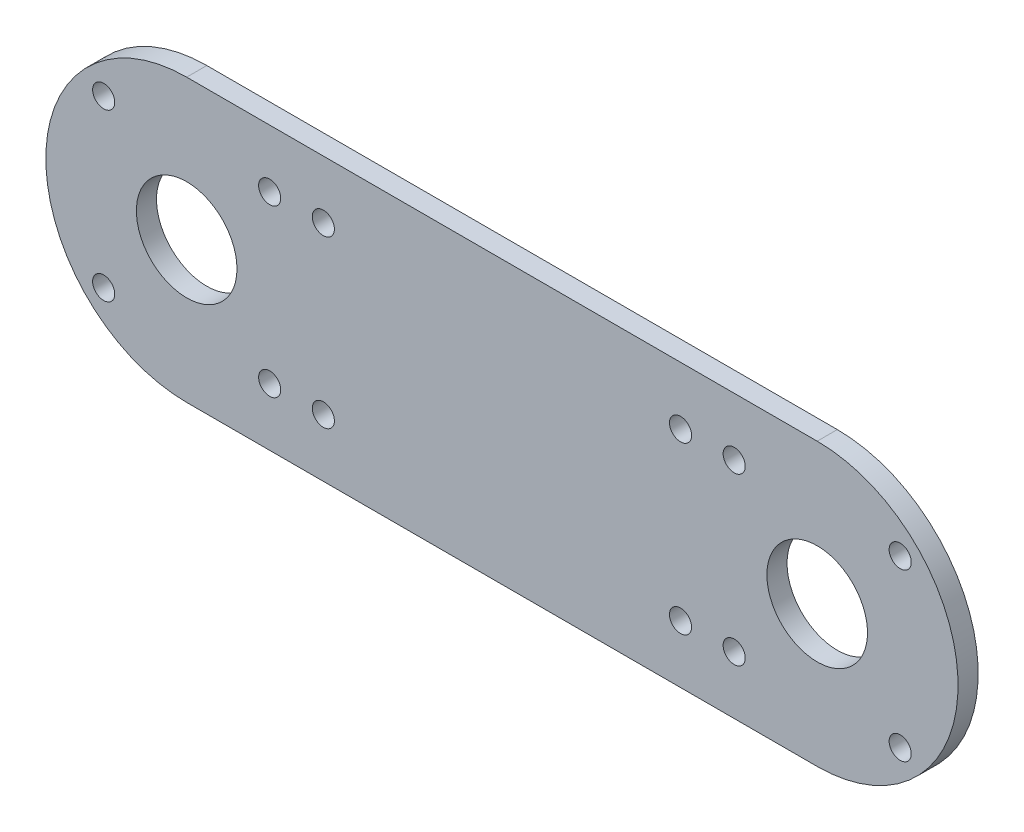
ISO-10303-21;
HEADER;
FILE_DESCRIPTION(('STEP AP214'),'2;1');
FILE_NAME('part.step','',(''),(''),'','','');
FILE_SCHEMA(('AUTOMOTIVE_DESIGN { 1 0 10303 214 1 1 1 1 }'));
ENDSEC;
DATA;
#1=APPLICATION_CONTEXT('core data for automotive mechanical design processes');
#2=APPLICATION_PROTOCOL_DEFINITION('international standard','automotive_design',2000,#1);
#3=PRODUCT_CONTEXT('',#1,'mechanical');
#4=PRODUCT('Part','Part','',(#3));
#5=PRODUCT_RELATED_PRODUCT_CATEGORY('part','',(#4));
#6=PRODUCT_DEFINITION_FORMATION('','',#4);
#7=PRODUCT_DEFINITION_CONTEXT('part definition',#1,'design');
#8=PRODUCT_DEFINITION('design','',#6,#7);
#9=PRODUCT_DEFINITION_SHAPE('','',#8);
#10=(LENGTH_UNIT() NAMED_UNIT(*) SI_UNIT(.MILLI.,.METRE.));
#11=(NAMED_UNIT(*) PLANE_ANGLE_UNIT() SI_UNIT($,.RADIAN.));
#12=(NAMED_UNIT(*) SI_UNIT($,.STERADIAN.) SOLID_ANGLE_UNIT());
#13=UNCERTAINTY_MEASURE_WITH_UNIT(LENGTH_MEASURE(1.E-05),#10,'distance_accuracy_value','');
#14=(GEOMETRIC_REPRESENTATION_CONTEXT(3) GLOBAL_UNCERTAINTY_ASSIGNED_CONTEXT((#13)) GLOBAL_UNIT_ASSIGNED_CONTEXT((#10,
#11,#12)) REPRESENTATION_CONTEXT('',''));
#15=CARTESIAN_POINT('',(0.,0.,0.));
#16=DIRECTION('',(0.,0.,1.));
#17=DIRECTION('',(1.,0.,0.));
#18=AXIS2_PLACEMENT_3D('',#15,#16,#17);
#19=CARTESIAN_POINT('',(82.5,-21.,3.));
#20=DIRECTION('',(0.,1.,0.));
#21=DIRECTION('',(0.,0.,1.));
#22=AXIS2_PLACEMENT_3D('',#19,#20,#21);
#23=PLANE('',#22);
#24=DIRECTION('',(1.,0.,0.));
#25=VECTOR('',#24,1.);
#26=CARTESIAN_POINT('',(82.5,-21.,3.));
#27=LINE('',#26,#25);
#28=CARTESIAN_POINT('',(-47.,-21.,3.));
#29=VERTEX_POINT('',#28);
#30=CARTESIAN_POINT('',(47.,-21.,3.));
#31=VERTEX_POINT('',#30);
#32=EDGE_CURVE('E43',#29,#31,#27,.T.);
#33=ORIENTED_EDGE('',*,*,#32,.F.);
#34=DIRECTION('',(0.,0.,1.));
#35=VECTOR('',#34,1.);
#36=CARTESIAN_POINT('',(-47.,-21.,0.));
#37=LINE('',#36,#35);
#38=CARTESIAN_POINT('',(-47.,-21.,0.));
#39=VERTEX_POINT('',#38);
#40=EDGE_CURVE('E82',#39,#29,#37,.T.);
#41=ORIENTED_EDGE('',*,*,#40,.F.);
#42=DIRECTION('',(1.,0.,0.));
#43=VECTOR('',#42,1.);
#44=CARTESIAN_POINT('',(82.5,-21.,0.));
#45=LINE('',#44,#43);
#46=CARTESIAN_POINT('',(47.,-21.,0.));
#47=VERTEX_POINT('',#46);
#48=EDGE_CURVE('E90',#39,#47,#45,.T.);
#49=ORIENTED_EDGE('',*,*,#48,.T.);
#50=DIRECTION('',(0.,0.,1.));
#51=VECTOR('',#50,1.);
#52=CARTESIAN_POINT('',(47.,-21.,0.));
#53=LINE('',#52,#51);
#54=EDGE_CURVE('E159',#47,#31,#53,.T.);
#55=ORIENTED_EDGE('',*,*,#54,.T.);
#56=EDGE_LOOP('',(#33,#41,#49,#55));
#57=FACE_BOUND('',#56,.T.);
#58=ADVANCED_FACE('F35',(#57),#23,.F.);
#59=CARTESIAN_POINT('',(82.5,21.,3.));
#60=DIRECTION('',(0.,-1.,0.));
#61=DIRECTION('',(0.,0.,-1.));
#62=AXIS2_PLACEMENT_3D('',#59,#60,#61);
#63=PLANE('',#62);
#64=DIRECTION('',(0.,0.,1.));
#65=VECTOR('',#64,1.);
#66=CARTESIAN_POINT('',(-47.,21.,0.));
#67=LINE('',#66,#65);
#68=CARTESIAN_POINT('',(-47.,21.,0.));
#69=VERTEX_POINT('',#68);
#70=CARTESIAN_POINT('',(-47.,21.,3.));
#71=VERTEX_POINT('',#70);
#72=EDGE_CURVE('E74',#69,#71,#67,.T.);
#73=ORIENTED_EDGE('',*,*,#72,.T.);
#74=DIRECTION('',(-1.,0.,0.));
#75=VECTOR('',#74,1.);
#76=CARTESIAN_POINT('',(82.5,21.,3.));
#77=LINE('',#76,#75);
#78=CARTESIAN_POINT('',(47.,21.,3.));
#79=VERTEX_POINT('',#78);
#80=EDGE_CURVE('E11',#79,#71,#77,.T.);
#81=ORIENTED_EDGE('',*,*,#80,.F.);
#82=DIRECTION('',(0.,0.,1.));
#83=VECTOR('',#82,1.);
#84=CARTESIAN_POINT('',(47.,21.,0.));
#85=LINE('',#84,#83);
#86=CARTESIAN_POINT('',(47.,21.,0.));
#87=VERTEX_POINT('',#86);
#88=EDGE_CURVE('E93',#87,#79,#85,.T.);
#89=ORIENTED_EDGE('',*,*,#88,.F.);
#90=DIRECTION('',(-1.,0.,0.));
#91=VECTOR('',#90,1.);
#92=CARTESIAN_POINT('',(82.5,21.,0.));
#93=LINE('',#92,#91);
#94=EDGE_CURVE('E38',#87,#69,#93,.T.);
#95=ORIENTED_EDGE('',*,*,#94,.T.);
#96=EDGE_LOOP('',(#73,#81,#89,#95));
#97=FACE_BOUND('',#96,.T.);
#98=ADVANCED_FACE('F92',(#97),#63,.F.);
#99=CARTESIAN_POINT('',(0.,0.,3.));
#100=DIRECTION('',(0.,0.,1.));
#101=DIRECTION('',(1.,0.,0.));
#102=AXIS2_PLACEMENT_3D('',#99,#100,#101);
#103=PLANE('',#102);
#104=CARTESIAN_POINT('',(-26.6256313292354,-12.3743686707646,3.));
#105=DIRECTION('',(0.,0.,1.));
#106=DIRECTION('',(1.,0.,0.));
#107=AXIS2_PLACEMENT_3D('',#104,#105,#106);
#108=CIRCLE('',#107,1.65);
#109=CARTESIAN_POINT('',(-24.9756313292354,-12.3743686707646,3.));
#110=VERTEX_POINT('',#109);
#111=EDGE_CURVE('E181',#110,#110,#108,.T.);
#112=ORIENTED_EDGE('',*,*,#111,.F.);
#113=EDGE_LOOP('',(#112));
#114=FACE_BOUND('',#113,.T.);
#115=CARTESIAN_POINT('',(26.6256313292354,12.3743686707646,3.));
#116=DIRECTION('',(0.,0.,1.));
#117=DIRECTION('',(1.,0.,0.));
#118=AXIS2_PLACEMENT_3D('',#115,#116,#117);
#119=CIRCLE('',#118,1.65);
#120=CARTESIAN_POINT('',(28.2756313292354,12.3743686707646,3.));
#121=VERTEX_POINT('',#120);
#122=EDGE_CURVE('E174',#121,#121,#119,.T.);
#123=ORIENTED_EDGE('',*,*,#122,.F.);
#124=EDGE_LOOP('',(#123));
#125=FACE_BOUND('',#124,.T.);
#126=CARTESIAN_POINT('',(26.6256313292354,-12.3743686707646,3.));
#127=DIRECTION('',(0.,0.,1.));
#128=DIRECTION('',(1.,0.,0.));
#129=AXIS2_PLACEMENT_3D('',#126,#127,#128);
#130=CIRCLE('',#129,1.65);
#131=CARTESIAN_POINT('',(28.2756313292354,-12.3743686707646,3.));
#132=VERTEX_POINT('',#131);
#133=EDGE_CURVE('E186',#132,#132,#130,.T.);
#134=ORIENTED_EDGE('',*,*,#133,.F.);
#135=EDGE_LOOP('',(#134));
#136=FACE_BOUND('',#135,.T.);
#137=CARTESIAN_POINT('',(-26.6256313292354,12.3743686707646,3.));
#138=DIRECTION('',(0.,0.,1.));
#139=DIRECTION('',(1.,0.,0.));
#140=AXIS2_PLACEMENT_3D('',#137,#138,#139);
#141=CIRCLE('',#140,1.65);
#142=CARTESIAN_POINT('',(-24.9756313292354,12.3743686707646,3.));
#143=VERTEX_POINT('',#142);
#144=EDGE_CURVE('E168',#143,#143,#141,.T.);
#145=ORIENTED_EDGE('',*,*,#144,.F.);
#146=EDGE_LOOP('',(#145));
#147=FACE_BOUND('',#146,.T.);
#148=CARTESIAN_POINT('',(-47.,0.,3.));
#149=DIRECTION('',(0.,0.,-1.));
#150=DIRECTION('',(1.,0.,0.));
#151=AXIS2_PLACEMENT_3D('',#148,#149,#150);
#152=CIRCLE('',#151,21.);
#153=EDGE_CURVE('E51',#29,#71,#152,.T.);
#154=ORIENTED_EDGE('',*,*,#153,.F.);
#155=ORIENTED_EDGE('',*,*,#32,.T.);
#156=CARTESIAN_POINT('',(47.,0.,3.));
#157=DIRECTION('',(0.,0.,-1.));
#158=DIRECTION('',(1.,0.,0.));
#159=AXIS2_PLACEMENT_3D('',#156,#157,#158);
#160=CIRCLE('',#159,21.);
#161=EDGE_CURVE('E162',#79,#31,#160,.T.);
#162=ORIENTED_EDGE('',*,*,#161,.F.);
#163=ORIENTED_EDGE('',*,*,#80,.T.);
#164=EDGE_LOOP('',(#154,#155,#162,#163));
#165=FACE_BOUND('',#164,.T.);
#166=CARTESIAN_POINT('',(59.3743686707646,12.3743686707646,3.));
#167=DIRECTION('',(0.,0.,1.));
#168=DIRECTION('',(-1.,0.,0.));
#169=AXIS2_PLACEMENT_3D('',#166,#167,#168);
#170=CIRCLE('',#169,1.65);
#171=CARTESIAN_POINT('',(57.7243686707646,12.3743686707646,3.));
#172=VERTEX_POINT('',#171);
#173=EDGE_CURVE('E145',#172,#172,#170,.T.);
#174=ORIENTED_EDGE('',*,*,#173,.F.);
#175=EDGE_LOOP('',(#174));
#176=FACE_BOUND('',#175,.T.);
#177=CARTESIAN_POINT('',(34.6256313292354,-12.3743686707646,3.));
#178=DIRECTION('',(0.,0.,1.));
#179=DIRECTION('',(-1.,0.,0.));
#180=AXIS2_PLACEMENT_3D('',#177,#178,#179);
#181=CIRCLE('',#180,1.65);
#182=CARTESIAN_POINT('',(32.9756313292354,-12.3743686707646,3.));
#183=VERTEX_POINT('',#182);
#184=EDGE_CURVE('E133',#183,#183,#181,.T.);
#185=ORIENTED_EDGE('',*,*,#184,.F.);
#186=EDGE_LOOP('',(#185));
#187=FACE_BOUND('',#186,.T.);
#188=CARTESIAN_POINT('',(-59.3743686707646,-12.3743686707646,3.));
#189=DIRECTION('',(0.,0.,1.));
#190=DIRECTION('',(1.,0.,0.));
#191=AXIS2_PLACEMENT_3D('',#188,#189,#190);
#192=CIRCLE('',#191,1.65);
#193=CARTESIAN_POINT('',(-57.7243686707646,-12.3743686707646,3.));
#194=VERTEX_POINT('',#193);
#195=EDGE_CURVE('E121',#194,#194,#192,.T.);
#196=ORIENTED_EDGE('',*,*,#195,.F.);
#197=EDGE_LOOP('',(#196));
#198=FACE_BOUND('',#197,.T.);
#199=CARTESIAN_POINT('',(-34.6256313292354,12.3743686707646,3.));
#200=DIRECTION('',(0.,0.,1.));
#201=DIRECTION('',(1.,0.,0.));
#202=AXIS2_PLACEMENT_3D('',#199,#200,#201);
#203=CIRCLE('',#202,1.65);
#204=CARTESIAN_POINT('',(-32.9756313292354,12.3743686707646,3.));
#205=VERTEX_POINT('',#204);
#206=EDGE_CURVE('E109',#205,#205,#203,.T.);
#207=ORIENTED_EDGE('',*,*,#206,.F.);
#208=EDGE_LOOP('',(#207));
#209=FACE_BOUND('',#208,.T.);
#210=CARTESIAN_POINT('',(-47.,0.,3.));
#211=DIRECTION('',(0.,0.,1.));
#212=DIRECTION('',(1.,0.,0.));
#213=AXIS2_PLACEMENT_3D('',#210,#211,#212);
#214=CIRCLE('',#213,7.5);
#215=CARTESIAN_POINT('',(-39.5,0.,3.));
#216=VERTEX_POINT('',#215);
#217=EDGE_CURVE('E96',#216,#216,#214,.T.);
#218=ORIENTED_EDGE('',*,*,#217,.F.);
#219=EDGE_LOOP('',(#218));
#220=FACE_BOUND('',#219,.T.);
#221=CARTESIAN_POINT('',(-59.3743686707646,12.3743686707646,3.));
#222=DIRECTION('',(0.,0.,1.));
#223=DIRECTION('',(1.,0.,0.));
#224=AXIS2_PLACEMENT_3D('',#221,#222,#223);
#225=CIRCLE('',#224,1.65);
#226=CARTESIAN_POINT('',(-57.7243686707646,12.3743686707646,3.));
#227=VERTEX_POINT('',#226);
#228=EDGE_CURVE('E104',#227,#227,#225,.T.);
#229=ORIENTED_EDGE('',*,*,#228,.F.);
#230=EDGE_LOOP('',(#229));
#231=FACE_BOUND('',#230,.T.);
#232=CARTESIAN_POINT('',(-34.6256313292354,-12.3743686707646,3.));
#233=DIRECTION('',(0.,0.,1.));
#234=DIRECTION('',(1.,0.,0.));
#235=AXIS2_PLACEMENT_3D('',#232,#233,#234);
#236=CIRCLE('',#235,1.65);
#237=CARTESIAN_POINT('',(-32.9756313292354,-12.3743686707646,3.));
#238=VERTEX_POINT('',#237);
#239=EDGE_CURVE('E115',#238,#238,#236,.T.);
#240=ORIENTED_EDGE('',*,*,#239,.F.);
#241=EDGE_LOOP('',(#240));
#242=FACE_BOUND('',#241,.T.);
#243=CARTESIAN_POINT('',(59.3743686707646,-12.3743686707646,3.));
#244=DIRECTION('',(0.,0.,1.));
#245=DIRECTION('',(-1.,0.,0.));
#246=AXIS2_PLACEMENT_3D('',#243,#244,#245);
#247=CIRCLE('',#246,1.65);
#248=CARTESIAN_POINT('',(57.7243686707646,-12.3743686707646,3.));
#249=VERTEX_POINT('',#248);
#250=EDGE_CURVE('E127',#249,#249,#247,.T.);
#251=ORIENTED_EDGE('',*,*,#250,.F.);
#252=EDGE_LOOP('',(#251));
#253=FACE_BOUND('',#252,.T.);
#254=CARTESIAN_POINT('',(34.6256313292354,12.3743686707646,3.));
#255=DIRECTION('',(0.,0.,1.));
#256=DIRECTION('',(-1.,0.,0.));
#257=AXIS2_PLACEMENT_3D('',#254,#255,#256);
#258=CIRCLE('',#257,1.65);
#259=CARTESIAN_POINT('',(32.9756313292354,12.3743686707646,3.));
#260=VERTEX_POINT('',#259);
#261=EDGE_CURVE('E139',#260,#260,#258,.T.);
#262=ORIENTED_EDGE('',*,*,#261,.F.);
#263=EDGE_LOOP('',(#262));
#264=FACE_BOUND('',#263,.T.);
#265=CARTESIAN_POINT('',(47.,0.,3.));
#266=DIRECTION('',(0.,0.,1.));
#267=DIRECTION('',(-1.,0.,0.));
#268=AXIS2_PLACEMENT_3D('',#265,#266,#267);
#269=CIRCLE('',#268,7.5);
#270=CARTESIAN_POINT('',(39.5,0.,3.));
#271=VERTEX_POINT('',#270);
#272=EDGE_CURVE('E151',#271,#271,#269,.T.);
#273=ORIENTED_EDGE('',*,*,#272,.F.);
#274=EDGE_LOOP('',(#273));
#275=FACE_BOUND('',#274,.T.);
#276=ADVANCED_FACE('F202',(#114,#125,#136,#147,#165,#176,#187,#198,#209,#220,#231,#242,#253,
#264,#275),#103,.T.);
#277=CARTESIAN_POINT('',(0.,0.,0.));
#278=DIRECTION('',(0.,0.,1.));
#279=DIRECTION('',(1.,0.,0.));
#280=AXIS2_PLACEMENT_3D('',#277,#278,#279);
#281=PLANE('',#280);
#282=CARTESIAN_POINT('',(-26.6256313292354,-12.3743686707646,0.));
#283=DIRECTION('',(0.,0.,1.));
#284=DIRECTION('',(1.,0.,0.));
#285=AXIS2_PLACEMENT_3D('',#282,#283,#284);
#286=CIRCLE('',#285,1.65);
#287=CARTESIAN_POINT('',(-24.9756313292354,-12.3743686707646,0.));
#288=VERTEX_POINT('',#287);
#289=EDGE_CURVE('E171',#288,#288,#286,.T.);
#290=ORIENTED_EDGE('',*,*,#289,.T.);
#291=EDGE_LOOP('',(#290));
#292=FACE_BOUND('',#291,.T.);
#293=CARTESIAN_POINT('',(26.6256313292354,12.3743686707646,0.));
#294=DIRECTION('',(0.,0.,1.));
#295=DIRECTION('',(1.,0.,0.));
#296=AXIS2_PLACEMENT_3D('',#293,#294,#295);
#297=CIRCLE('',#296,1.65);
#298=CARTESIAN_POINT('',(28.2756313292354,12.3743686707646,0.));
#299=VERTEX_POINT('',#298);
#300=EDGE_CURVE('E177',#299,#299,#297,.T.);
#301=ORIENTED_EDGE('',*,*,#300,.T.);
#302=EDGE_LOOP('',(#301));
#303=FACE_BOUND('',#302,.T.);
#304=CARTESIAN_POINT('',(26.6256313292354,-12.3743686707646,0.));
#305=DIRECTION('',(0.,0.,1.));
#306=DIRECTION('',(1.,0.,0.));
#307=AXIS2_PLACEMENT_3D('',#304,#305,#306);
#308=CIRCLE('',#307,1.65);
#309=CARTESIAN_POINT('',(28.2756313292354,-12.3743686707646,0.));
#310=VERTEX_POINT('',#309);
#311=EDGE_CURVE('E178',#310,#310,#308,.T.);
#312=ORIENTED_EDGE('',*,*,#311,.T.);
#313=EDGE_LOOP('',(#312));
#314=FACE_BOUND('',#313,.T.);
#315=CARTESIAN_POINT('',(-26.6256313292354,12.3743686707646,0.));
#316=DIRECTION('',(0.,0.,1.));
#317=DIRECTION('',(1.,0.,0.));
#318=AXIS2_PLACEMENT_3D('',#315,#316,#317);
#319=CIRCLE('',#318,1.65);
#320=CARTESIAN_POINT('',(-24.9756313292354,12.3743686707646,0.));
#321=VERTEX_POINT('',#320);
#322=EDGE_CURVE('E164',#321,#321,#319,.T.);
#323=ORIENTED_EDGE('',*,*,#322,.T.);
#324=EDGE_LOOP('',(#323));
#325=FACE_BOUND('',#324,.T.);
#326=ORIENTED_EDGE('',*,*,#48,.F.);
#327=CARTESIAN_POINT('',(-47.,0.,0.));
#328=DIRECTION('',(0.,0.,-1.));
#329=DIRECTION('',(1.,0.,0.));
#330=AXIS2_PLACEMENT_3D('',#327,#328,#329);
#331=CIRCLE('',#330,21.);
#332=EDGE_CURVE('E77',#39,#69,#331,.T.);
#333=ORIENTED_EDGE('',*,*,#332,.T.);
#334=ORIENTED_EDGE('',*,*,#94,.F.);
#335=CARTESIAN_POINT('',(47.,0.,0.));
#336=DIRECTION('',(0.,0.,-1.));
#337=DIRECTION('',(1.,0.,0.));
#338=AXIS2_PLACEMENT_3D('',#335,#336,#337);
#339=CIRCLE('',#338,21.);
#340=EDGE_CURVE('E59',#87,#47,#339,.T.);
#341=ORIENTED_EDGE('',*,*,#340,.T.);
#342=EDGE_LOOP('',(#326,#333,#334,#341));
#343=FACE_BOUND('',#342,.T.);
#344=CARTESIAN_POINT('',(-47.,0.,0.));
#345=DIRECTION('',(0.,0.,1.));
#346=DIRECTION('',(1.,0.,0.));
#347=AXIS2_PLACEMENT_3D('',#344,#345,#346);
#348=CIRCLE('',#347,7.5);
#349=CARTESIAN_POINT('',(-39.5,0.,0.));
#350=VERTEX_POINT('',#349);
#351=EDGE_CURVE('E100',#350,#350,#348,.T.);
#352=ORIENTED_EDGE('',*,*,#351,.T.);
#353=EDGE_LOOP('',(#352));
#354=FACE_BOUND('',#353,.T.);
#355=CARTESIAN_POINT('',(-59.3743686707646,12.3743686707646,0.));
#356=DIRECTION('',(0.,0.,1.));
#357=DIRECTION('',(1.,0.,0.));
#358=AXIS2_PLACEMENT_3D('',#355,#356,#357);
#359=CIRCLE('',#358,1.65);
#360=CARTESIAN_POINT('',(-57.7243686707646,12.3743686707646,0.));
#361=VERTEX_POINT('',#360);
#362=EDGE_CURVE('E106',#361,#361,#359,.T.);
#363=ORIENTED_EDGE('',*,*,#362,.T.);
#364=EDGE_LOOP('',(#363));
#365=FACE_BOUND('',#364,.T.);
#366=CARTESIAN_POINT('',(-34.6256313292354,12.3743686707646,0.));
#367=DIRECTION('',(0.,0.,1.));
#368=DIRECTION('',(1.,0.,0.));
#369=AXIS2_PLACEMENT_3D('',#366,#367,#368);
#370=CIRCLE('',#369,1.65);
#371=CARTESIAN_POINT('',(-32.9756313292354,12.3743686707646,0.));
#372=VERTEX_POINT('',#371);
#373=EDGE_CURVE('E112',#372,#372,#370,.T.);
#374=ORIENTED_EDGE('',*,*,#373,.T.);
#375=EDGE_LOOP('',(#374));
#376=FACE_BOUND('',#375,.T.);
#377=CARTESIAN_POINT('',(-34.6256313292354,-12.3743686707646,0.));
#378=DIRECTION('',(0.,0.,1.));
#379=DIRECTION('',(1.,0.,0.));
#380=AXIS2_PLACEMENT_3D('',#377,#378,#379);
#381=CIRCLE('',#380,1.65);
#382=CARTESIAN_POINT('',(-32.9756313292354,-12.3743686707646,0.));
#383=VERTEX_POINT('',#382);
#384=EDGE_CURVE('E118',#383,#383,#381,.T.);
#385=ORIENTED_EDGE('',*,*,#384,.T.);
#386=EDGE_LOOP('',(#385));
#387=FACE_BOUND('',#386,.T.);
#388=CARTESIAN_POINT('',(-59.3743686707646,-12.3743686707646,0.));
#389=DIRECTION('',(0.,0.,1.));
#390=DIRECTION('',(1.,0.,0.));
#391=AXIS2_PLACEMENT_3D('',#388,#389,#390);
#392=CIRCLE('',#391,1.65);
#393=CARTESIAN_POINT('',(-57.7243686707646,-12.3743686707646,0.));
#394=VERTEX_POINT('',#393);
#395=EDGE_CURVE('E124',#394,#394,#392,.T.);
#396=ORIENTED_EDGE('',*,*,#395,.T.);
#397=EDGE_LOOP('',(#396));
#398=FACE_BOUND('',#397,.T.);
#399=CARTESIAN_POINT('',(59.3743686707646,-12.3743686707646,0.));
#400=DIRECTION('',(0.,0.,1.));
#401=DIRECTION('',(-1.,0.,0.));
#402=AXIS2_PLACEMENT_3D('',#399,#400,#401);
#403=CIRCLE('',#402,1.65);
#404=CARTESIAN_POINT('',(57.7243686707646,-12.3743686707646,0.));
#405=VERTEX_POINT('',#404);
#406=EDGE_CURVE('E130',#405,#405,#403,.T.);
#407=ORIENTED_EDGE('',*,*,#406,.T.);
#408=EDGE_LOOP('',(#407));
#409=FACE_BOUND('',#408,.T.);
#410=CARTESIAN_POINT('',(34.6256313292354,-12.3743686707646,0.));
#411=DIRECTION('',(0.,0.,1.));
#412=DIRECTION('',(-1.,0.,0.));
#413=AXIS2_PLACEMENT_3D('',#410,#411,#412);
#414=CIRCLE('',#413,1.65);
#415=CARTESIAN_POINT('',(32.9756313292354,-12.3743686707646,0.));
#416=VERTEX_POINT('',#415);
#417=EDGE_CURVE('E136',#416,#416,#414,.T.);
#418=ORIENTED_EDGE('',*,*,#417,.T.);
#419=EDGE_LOOP('',(#418));
#420=FACE_BOUND('',#419,.T.);
#421=CARTESIAN_POINT('',(34.6256313292354,12.3743686707646,0.));
#422=DIRECTION('',(0.,0.,1.));
#423=DIRECTION('',(-1.,0.,0.));
#424=AXIS2_PLACEMENT_3D('',#421,#422,#423);
#425=CIRCLE('',#424,1.65);
#426=CARTESIAN_POINT('',(32.9756313292354,12.3743686707646,0.));
#427=VERTEX_POINT('',#426);
#428=EDGE_CURVE('E142',#427,#427,#425,.T.);
#429=ORIENTED_EDGE('',*,*,#428,.T.);
#430=EDGE_LOOP('',(#429));
#431=FACE_BOUND('',#430,.T.);
#432=CARTESIAN_POINT('',(59.3743686707646,12.3743686707646,0.));
#433=DIRECTION('',(0.,0.,1.));
#434=DIRECTION('',(-1.,0.,0.));
#435=AXIS2_PLACEMENT_3D('',#432,#433,#434);
#436=CIRCLE('',#435,1.65);
#437=CARTESIAN_POINT('',(57.7243686707646,12.3743686707646,0.));
#438=VERTEX_POINT('',#437);
#439=EDGE_CURVE('E148',#438,#438,#436,.T.);
#440=ORIENTED_EDGE('',*,*,#439,.T.);
#441=EDGE_LOOP('',(#440));
#442=FACE_BOUND('',#441,.T.);
#443=CARTESIAN_POINT('',(47.,0.,0.));
#444=DIRECTION('',(0.,0.,1.));
#445=DIRECTION('',(-1.,0.,0.));
#446=AXIS2_PLACEMENT_3D('',#443,#444,#445);
#447=CIRCLE('',#446,7.5);
#448=CARTESIAN_POINT('',(39.5,0.,0.));
#449=VERTEX_POINT('',#448);
#450=EDGE_CURVE('E154',#449,#449,#447,.T.);
#451=ORIENTED_EDGE('',*,*,#450,.T.);
#452=EDGE_LOOP('',(#451));
#453=FACE_BOUND('',#452,.T.);
#454=ADVANCED_FACE('F87',(#292,#303,#314,#325,#343,#354,#365,#376,#387,#398,#409,#420,#431,#442,
#453),#281,.F.);
#455=CARTESIAN_POINT('',(-47.,0.,3.));
#456=DIRECTION('',(0.,0.,-1.));
#457=DIRECTION('',(-1.,0.,0.));
#458=AXIS2_PLACEMENT_3D('',#455,#456,#457);
#459=CYLINDRICAL_SURFACE('',#458,7.5);
#460=ORIENTED_EDGE('',*,*,#217,.T.);
#461=EDGE_LOOP('',(#460));
#462=FACE_BOUND('',#461,.T.);
#463=ORIENTED_EDGE('',*,*,#351,.F.);
#464=EDGE_LOOP('',(#463));
#465=FACE_BOUND('',#464,.T.);
#466=ADVANCED_FACE('F240',(#462,#465),#459,.F.);
#467=CARTESIAN_POINT('',(-59.3743686707646,12.3743686707646,3.));
#468=DIRECTION('',(0.,0.,-1.));
#469=DIRECTION('',(-1.,0.,0.));
#470=AXIS2_PLACEMENT_3D('',#467,#468,#469);
#471=CYLINDRICAL_SURFACE('',#470,1.65);
#472=ORIENTED_EDGE('',*,*,#228,.T.);
#473=EDGE_LOOP('',(#472));
#474=FACE_BOUND('',#473,.T.);
#475=ORIENTED_EDGE('',*,*,#362,.F.);
#476=EDGE_LOOP('',(#475));
#477=FACE_BOUND('',#476,.T.);
#478=ADVANCED_FACE('F246',(#474,#477),#471,.F.);
#479=CARTESIAN_POINT('',(-34.6256313292354,12.3743686707646,3.));
#480=DIRECTION('',(0.,0.,-1.));
#481=DIRECTION('',(-1.,0.,0.));
#482=AXIS2_PLACEMENT_3D('',#479,#480,#481);
#483=CYLINDRICAL_SURFACE('',#482,1.65);
#484=ORIENTED_EDGE('',*,*,#206,.T.);
#485=EDGE_LOOP('',(#484));
#486=FACE_BOUND('',#485,.T.);
#487=ORIENTED_EDGE('',*,*,#373,.F.);
#488=EDGE_LOOP('',(#487));
#489=FACE_BOUND('',#488,.T.);
#490=ADVANCED_FACE('F285',(#486,#489),#483,.F.);
#491=CARTESIAN_POINT('',(-34.6256313292354,-12.3743686707646,3.));
#492=DIRECTION('',(0.,0.,-1.));
#493=DIRECTION('',(-1.,0.,0.));
#494=AXIS2_PLACEMENT_3D('',#491,#492,#493);
#495=CYLINDRICAL_SURFACE('',#494,1.65);
#496=ORIENTED_EDGE('',*,*,#239,.T.);
#497=EDGE_LOOP('',(#496));
#498=FACE_BOUND('',#497,.T.);
#499=ORIENTED_EDGE('',*,*,#384,.F.);
#500=EDGE_LOOP('',(#499));
#501=FACE_BOUND('',#500,.T.);
#502=ADVANCED_FACE('F281',(#498,#501),#495,.F.);
#503=CARTESIAN_POINT('',(-59.3743686707646,-12.3743686707646,3.));
#504=DIRECTION('',(0.,0.,-1.));
#505=DIRECTION('',(-1.,0.,0.));
#506=AXIS2_PLACEMENT_3D('',#503,#504,#505);
#507=CYLINDRICAL_SURFACE('',#506,1.65);
#508=ORIENTED_EDGE('',*,*,#195,.T.);
#509=EDGE_LOOP('',(#508));
#510=FACE_BOUND('',#509,.T.);
#511=ORIENTED_EDGE('',*,*,#395,.F.);
#512=EDGE_LOOP('',(#511));
#513=FACE_BOUND('',#512,.T.);
#514=ADVANCED_FACE('F277',(#510,#513),#507,.F.);
#515=CARTESIAN_POINT('',(59.3743686707646,-12.3743686707646,3.));
#516=DIRECTION('',(0.,0.,-1.));
#517=DIRECTION('',(-1.,0.,0.));
#518=AXIS2_PLACEMENT_3D('',#515,#516,#517);
#519=CYLINDRICAL_SURFACE('',#518,1.65);
#520=ORIENTED_EDGE('',*,*,#250,.T.);
#521=EDGE_LOOP('',(#520));
#522=FACE_BOUND('',#521,.T.);
#523=ORIENTED_EDGE('',*,*,#406,.F.);
#524=EDGE_LOOP('',(#523));
#525=FACE_BOUND('',#524,.T.);
#526=ADVANCED_FACE('F273',(#522,#525),#519,.F.);
#527=CARTESIAN_POINT('',(34.6256313292354,-12.3743686707646,3.));
#528=DIRECTION('',(0.,0.,-1.));
#529=DIRECTION('',(-1.,0.,0.));
#530=AXIS2_PLACEMENT_3D('',#527,#528,#529);
#531=CYLINDRICAL_SURFACE('',#530,1.65);
#532=ORIENTED_EDGE('',*,*,#184,.T.);
#533=EDGE_LOOP('',(#532));
#534=FACE_BOUND('',#533,.T.);
#535=ORIENTED_EDGE('',*,*,#417,.F.);
#536=EDGE_LOOP('',(#535));
#537=FACE_BOUND('',#536,.T.);
#538=ADVANCED_FACE('F269',(#534,#537),#531,.F.);
#539=CARTESIAN_POINT('',(34.6256313292354,12.3743686707646,3.));
#540=DIRECTION('',(0.,0.,-1.));
#541=DIRECTION('',(-1.,0.,0.));
#542=AXIS2_PLACEMENT_3D('',#539,#540,#541);
#543=CYLINDRICAL_SURFACE('',#542,1.65);
#544=ORIENTED_EDGE('',*,*,#261,.T.);
#545=EDGE_LOOP('',(#544));
#546=FACE_BOUND('',#545,.T.);
#547=ORIENTED_EDGE('',*,*,#428,.F.);
#548=EDGE_LOOP('',(#547));
#549=FACE_BOUND('',#548,.T.);
#550=ADVANCED_FACE('F265',(#546,#549),#543,.F.);
#551=CARTESIAN_POINT('',(59.3743686707646,12.3743686707646,3.));
#552=DIRECTION('',(0.,0.,-1.));
#553=DIRECTION('',(-1.,0.,0.));
#554=AXIS2_PLACEMENT_3D('',#551,#552,#553);
#555=CYLINDRICAL_SURFACE('',#554,1.65);
#556=ORIENTED_EDGE('',*,*,#173,.T.);
#557=EDGE_LOOP('',(#556));
#558=FACE_BOUND('',#557,.T.);
#559=ORIENTED_EDGE('',*,*,#439,.F.);
#560=EDGE_LOOP('',(#559));
#561=FACE_BOUND('',#560,.T.);
#562=ADVANCED_FACE('F235',(#558,#561),#555,.F.);
#563=CARTESIAN_POINT('',(47.,0.,3.));
#564=DIRECTION('',(0.,0.,-1.));
#565=DIRECTION('',(-1.,0.,0.));
#566=AXIS2_PLACEMENT_3D('',#563,#564,#565);
#567=CYLINDRICAL_SURFACE('',#566,7.5);
#568=ORIENTED_EDGE('',*,*,#272,.T.);
#569=EDGE_LOOP('',(#568));
#570=FACE_BOUND('',#569,.T.);
#571=ORIENTED_EDGE('',*,*,#450,.F.);
#572=EDGE_LOOP('',(#571));
#573=FACE_BOUND('',#572,.T.);
#574=ADVANCED_FACE('F231',(#570,#573),#567,.F.);
#575=CARTESIAN_POINT('',(47.,0.,0.));
#576=DIRECTION('',(0.,0.,1.));
#577=DIRECTION('',(1.,0.,0.));
#578=AXIS2_PLACEMENT_3D('',#575,#576,#577);
#579=CYLINDRICAL_SURFACE('',#578,21.);
#580=ORIENTED_EDGE('',*,*,#161,.T.);
#581=ORIENTED_EDGE('',*,*,#54,.F.);
#582=ORIENTED_EDGE('',*,*,#340,.F.);
#583=ORIENTED_EDGE('',*,*,#88,.T.);
#584=EDGE_LOOP('',(#580,#581,#582,#583));
#585=FACE_BOUND('',#584,.T.);
#586=ADVANCED_FACE('F234',(#585),#579,.T.);
#587=CARTESIAN_POINT('',(-47.,0.,0.));
#588=DIRECTION('',(0.,0.,1.));
#589=DIRECTION('',(1.,0.,0.));
#590=AXIS2_PLACEMENT_3D('',#587,#588,#589);
#591=CYLINDRICAL_SURFACE('',#590,21.);
#592=ORIENTED_EDGE('',*,*,#153,.T.);
#593=ORIENTED_EDGE('',*,*,#72,.F.);
#594=ORIENTED_EDGE('',*,*,#332,.F.);
#595=ORIENTED_EDGE('',*,*,#40,.T.);
#596=EDGE_LOOP('',(#592,#593,#594,#595));
#597=FACE_BOUND('',#596,.T.);
#598=ADVANCED_FACE('F76',(#597),#591,.T.);
#599=CARTESIAN_POINT('',(-26.6256313292354,12.3743686707646,0.));
#600=DIRECTION('',(0.,0.,1.));
#601=DIRECTION('',(1.,0.,0.));
#602=AXIS2_PLACEMENT_3D('',#599,#600,#601);
#603=CYLINDRICAL_SURFACE('',#602,1.65);
#604=ORIENTED_EDGE('',*,*,#322,.F.);
#605=EDGE_LOOP('',(#604));
#606=FACE_BOUND('',#605,.T.);
#607=ORIENTED_EDGE('',*,*,#144,.T.);
#608=EDGE_LOOP('',(#607));
#609=FACE_BOUND('',#608,.T.);
#610=ADVANCED_FACE('F198',(#606,#609),#603,.F.);
#611=CARTESIAN_POINT('',(26.6256313292354,-12.3743686707646,0.));
#612=DIRECTION('',(0.,0.,1.));
#613=DIRECTION('',(1.,0.,0.));
#614=AXIS2_PLACEMENT_3D('',#611,#612,#613);
#615=CYLINDRICAL_SURFACE('',#614,1.65);
#616=ORIENTED_EDGE('',*,*,#311,.F.);
#617=EDGE_LOOP('',(#616));
#618=FACE_BOUND('',#617,.T.);
#619=ORIENTED_EDGE('',*,*,#133,.T.);
#620=EDGE_LOOP('',(#619));
#621=FACE_BOUND('',#620,.T.);
#622=ADVANCED_FACE('F194',(#618,#621),#615,.F.);
#623=CARTESIAN_POINT('',(26.6256313292354,12.3743686707646,0.));
#624=DIRECTION('',(0.,0.,1.));
#625=DIRECTION('',(1.,0.,0.));
#626=AXIS2_PLACEMENT_3D('',#623,#624,#625);
#627=CYLINDRICAL_SURFACE('',#626,1.65);
#628=ORIENTED_EDGE('',*,*,#300,.F.);
#629=EDGE_LOOP('',(#628));
#630=FACE_BOUND('',#629,.T.);
#631=ORIENTED_EDGE('',*,*,#122,.T.);
#632=EDGE_LOOP('',(#631));
#633=FACE_BOUND('',#632,.T.);
#634=ADVANCED_FACE('F197',(#630,#633),#627,.F.);
#635=CARTESIAN_POINT('',(-26.6256313292354,-12.3743686707646,0.));
#636=DIRECTION('',(0.,0.,1.));
#637=DIRECTION('',(1.,0.,0.));
#638=AXIS2_PLACEMENT_3D('',#635,#636,#637);
#639=CYLINDRICAL_SURFACE('',#638,1.65);
#640=ORIENTED_EDGE('',*,*,#289,.F.);
#641=EDGE_LOOP('',(#640));
#642=FACE_BOUND('',#641,.T.);
#643=ORIENTED_EDGE('',*,*,#111,.T.);
#644=EDGE_LOOP('',(#643));
#645=FACE_BOUND('',#644,.T.);
#646=ADVANCED_FACE('F406',(#642,#645),#639,.F.);
#647=CLOSED_SHELL('',(#58,#98,#276,#454,#466,#478,#490,#502,#514,#526,#538,#550,#562,#574,#586,
#598,#610,#622,#634,#646));
#648=MANIFOLD_SOLID_BREP('B2',#647);
#649=ADVANCED_BREP_SHAPE_REPRESENTATION('',(#18,#648),#14);
#650=SHAPE_DEFINITION_REPRESENTATION(#9,#649);
ENDSEC;
END-ISO-10303-21;
